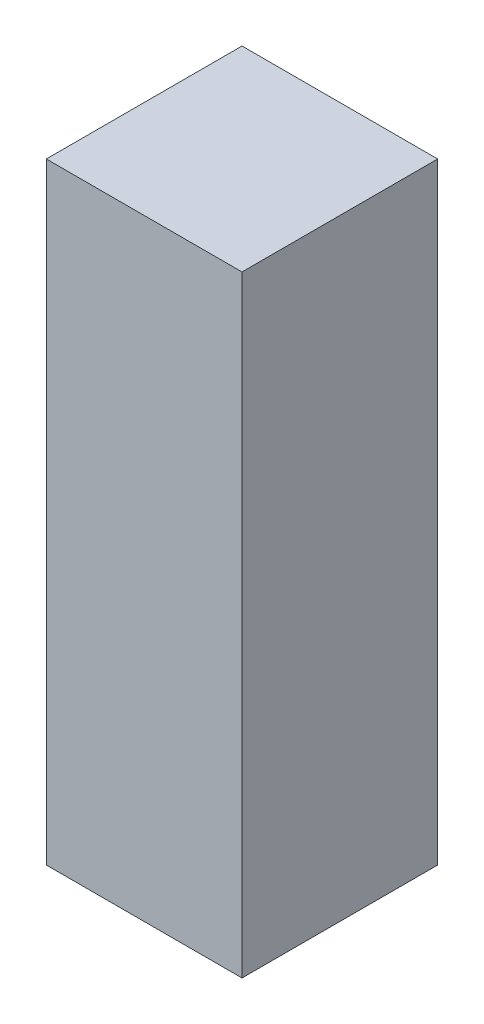
ISO-10303-21;
HEADER;
FILE_DESCRIPTION(('STEP AP214'),'2;1');
FILE_NAME('part.step','',(''),(''),'','','');
FILE_SCHEMA(('AUTOMOTIVE_DESIGN { 1 0 10303 214 1 1 1 1 }'));
ENDSEC;
DATA;
#1=APPLICATION_CONTEXT('core data for automotive mechanical design processes');
#2=APPLICATION_PROTOCOL_DEFINITION('international standard','automotive_design',2000,#1);
#3=PRODUCT_CONTEXT('',#1,'mechanical');
#4=PRODUCT('Part','Part','',(#3));
#5=PRODUCT_RELATED_PRODUCT_CATEGORY('part','',(#4));
#6=PRODUCT_DEFINITION_FORMATION('','',#4);
#7=PRODUCT_DEFINITION_CONTEXT('part definition',#1,'design');
#8=PRODUCT_DEFINITION('design','',#6,#7);
#9=PRODUCT_DEFINITION_SHAPE('','',#8);
#10=(LENGTH_UNIT() NAMED_UNIT(*) SI_UNIT(.MILLI.,.METRE.));
#11=(NAMED_UNIT(*) PLANE_ANGLE_UNIT() SI_UNIT($,.RADIAN.));
#12=(NAMED_UNIT(*) SI_UNIT($,.STERADIAN.) SOLID_ANGLE_UNIT());
#13=UNCERTAINTY_MEASURE_WITH_UNIT(LENGTH_MEASURE(1.E-05),#10,'distance_accuracy_value','');
#14=(GEOMETRIC_REPRESENTATION_CONTEXT(3) GLOBAL_UNCERTAINTY_ASSIGNED_CONTEXT((#13)) GLOBAL_UNIT_ASSIGNED_CONTEXT((#10,
#11,#12)) REPRESENTATION_CONTEXT('',''));
#15=CARTESIAN_POINT('',(0.,0.,0.));
#16=DIRECTION('',(0.,0.,1.));
#17=DIRECTION('',(1.,0.,0.));
#18=AXIS2_PLACEMENT_3D('',#15,#16,#17);
#19=CARTESIAN_POINT('',(-51.7257785467128,250.,-52.1651980029239));
#20=DIRECTION('',(1.,0.,0.));
#21=DIRECTION('',(0.,0.,-1.));
#22=AXIS2_PLACEMENT_3D('',#19,#20,#21);
#23=PLANE('',#22);
#24=DIRECTION('',(0.,0.,1.));
#25=VECTOR('',#24,1.);
#26=CARTESIAN_POINT('',(-51.7257785467128,0.,-52.1651980029239));
#27=LINE('',#26,#25);
#28=CARTESIAN_POINT('',(-51.7257785467128,0.,-52.1651980029239));
#29=VERTEX_POINT('',#28);
#30=CARTESIAN_POINT('',(-51.7257785467128,0.,27.8348019970761));
#31=VERTEX_POINT('',#30);
#32=EDGE_CURVE('E113',#29,#31,#27,.T.);
#33=ORIENTED_EDGE('',*,*,#32,.T.);
#34=DIRECTION('',(0.,-1.,0.));
#35=VECTOR('',#34,1.);
#36=CARTESIAN_POINT('',(-51.7257785467128,250.,27.8348019970761));
#37=LINE('',#36,#35);
#38=CARTESIAN_POINT('',(-51.7257785467128,250.,27.8348019970761));
#39=VERTEX_POINT('',#38);
#40=EDGE_CURVE('E11',#39,#31,#37,.T.);
#41=ORIENTED_EDGE('',*,*,#40,.F.);
#42=DIRECTION('',(0.,0.,1.));
#43=VECTOR('',#42,1.);
#44=CARTESIAN_POINT('',(-51.7257785467128,250.,-52.1651980029239));
#45=LINE('',#44,#43);
#46=CARTESIAN_POINT('',(-51.7257785467128,250.,-52.1651980029239));
#47=VERTEX_POINT('',#46);
#48=EDGE_CURVE('E97',#47,#39,#45,.T.);
#49=ORIENTED_EDGE('',*,*,#48,.F.);
#50=DIRECTION('',(0.,-1.,0.));
#51=VECTOR('',#50,1.);
#52=CARTESIAN_POINT('',(-51.7257785467128,250.,-52.1651980029239));
#53=LINE('',#52,#51);
#54=EDGE_CURVE('E109',#47,#29,#53,.T.);
#55=ORIENTED_EDGE('',*,*,#54,.T.);
#56=EDGE_LOOP('',(#33,#41,#49,#55));
#57=FACE_BOUND('',#56,.T.);
#58=ADVANCED_FACE('F45',(#57),#23,.F.);
#59=CARTESIAN_POINT('',(-51.7257785467128,250.,27.8348019970761));
#60=DIRECTION('',(0.,0.,-1.));
#61=DIRECTION('',(-1.,0.,0.));
#62=AXIS2_PLACEMENT_3D('',#59,#60,#61);
#63=PLANE('',#62);
#64=DIRECTION('',(1.,0.,0.));
#65=VECTOR('',#64,1.);
#66=CARTESIAN_POINT('',(-51.7257785467128,0.,27.8348019970761));
#67=LINE('',#66,#65);
#68=CARTESIAN_POINT('',(28.2742214532872,0.,27.8348019970761));
#69=VERTEX_POINT('',#68);
#70=EDGE_CURVE('E102',#31,#69,#67,.T.);
#71=ORIENTED_EDGE('',*,*,#70,.T.);
#72=DIRECTION('',(0.,-1.,0.));
#73=VECTOR('',#72,1.);
#74=CARTESIAN_POINT('',(28.2742214532872,250.,27.8348019970761));
#75=LINE('',#74,#73);
#76=CARTESIAN_POINT('',(28.2742214532872,250.,27.8348019970761));
#77=VERTEX_POINT('',#76);
#78=EDGE_CURVE('E54',#77,#69,#75,.T.);
#79=ORIENTED_EDGE('',*,*,#78,.F.);
#80=DIRECTION('',(1.,0.,0.));
#81=VECTOR('',#80,1.);
#82=CARTESIAN_POINT('',(-51.7257785467128,250.,27.8348019970761));
#83=LINE('',#82,#81);
#84=EDGE_CURVE('E92',#39,#77,#83,.T.);
#85=ORIENTED_EDGE('',*,*,#84,.F.);
#86=ORIENTED_EDGE('',*,*,#40,.T.);
#87=EDGE_LOOP('',(#71,#79,#85,#86));
#88=FACE_BOUND('',#87,.T.);
#89=ADVANCED_FACE('F101',(#88),#63,.F.);
#90=CARTESIAN_POINT('',(28.2742214532872,250.,-52.1651980029239));
#91=DIRECTION('',(-1.,0.,0.));
#92=DIRECTION('',(0.,0.,1.));
#93=AXIS2_PLACEMENT_3D('',#90,#91,#92);
#94=PLANE('',#93);
#95=DIRECTION('',(0.,0.,-1.));
#96=VECTOR('',#95,1.);
#97=CARTESIAN_POINT('',(28.2742214532872,0.,-52.1651980029239));
#98=LINE('',#97,#96);
#99=CARTESIAN_POINT('',(28.2742214532872,0.,-52.1651980029239));
#100=VERTEX_POINT('',#99);
#101=EDGE_CURVE('E79',#69,#100,#98,.T.);
#102=ORIENTED_EDGE('',*,*,#101,.T.);
#103=DIRECTION('',(0.,-1.,0.));
#104=VECTOR('',#103,1.);
#105=CARTESIAN_POINT('',(28.2742214532872,250.,-52.1651980029239));
#106=LINE('',#105,#104);
#107=CARTESIAN_POINT('',(28.2742214532872,250.,-52.1651980029239));
#108=VERTEX_POINT('',#107);
#109=EDGE_CURVE('E104',#108,#100,#106,.T.);
#110=ORIENTED_EDGE('',*,*,#109,.F.);
#111=DIRECTION('',(0.,0.,-1.));
#112=VECTOR('',#111,1.);
#113=CARTESIAN_POINT('',(28.2742214532872,250.,-52.1651980029239));
#114=LINE('',#113,#112);
#115=EDGE_CURVE('E95',#77,#108,#114,.T.);
#116=ORIENTED_EDGE('',*,*,#115,.F.);
#117=ORIENTED_EDGE('',*,*,#78,.T.);
#118=EDGE_LOOP('',(#102,#110,#116,#117));
#119=FACE_BOUND('',#118,.T.);
#120=ADVANCED_FACE('F105',(#119),#94,.F.);
#121=CARTESIAN_POINT('',(-51.7257785467128,250.,-52.1651980029239));
#122=DIRECTION('',(0.,0.,1.));
#123=DIRECTION('',(1.,0.,0.));
#124=AXIS2_PLACEMENT_3D('',#121,#122,#123);
#125=PLANE('',#124);
#126=DIRECTION('',(-1.,0.,0.));
#127=VECTOR('',#126,1.);
#128=CARTESIAN_POINT('',(-51.7257785467128,0.,-52.1651980029239));
#129=LINE('',#128,#127);
#130=EDGE_CURVE('E85',#100,#29,#129,.T.);
#131=ORIENTED_EDGE('',*,*,#130,.T.);
#132=ORIENTED_EDGE('',*,*,#54,.F.);
#133=DIRECTION('',(-1.,0.,0.));
#134=VECTOR('',#133,1.);
#135=CARTESIAN_POINT('',(-51.7257785467128,250.,-52.1651980029239));
#136=LINE('',#135,#134);
#137=EDGE_CURVE('E62',#108,#47,#136,.T.);
#138=ORIENTED_EDGE('',*,*,#137,.F.);
#139=ORIENTED_EDGE('',*,*,#109,.T.);
#140=EDGE_LOOP('',(#131,#132,#138,#139));
#141=FACE_BOUND('',#140,.T.);
#142=ADVANCED_FACE('F126',(#141),#125,.F.);
#143=CARTESIAN_POINT('',(0.,250.,0.));
#144=DIRECTION('',(0.,1.,0.));
#145=DIRECTION('',(0.,0.,1.));
#146=AXIS2_PLACEMENT_3D('',#143,#144,#145);
#147=PLANE('',#146);
#148=ORIENTED_EDGE('',*,*,#48,.T.);
#149=ORIENTED_EDGE('',*,*,#84,.T.);
#150=ORIENTED_EDGE('',*,*,#115,.T.);
#151=ORIENTED_EDGE('',*,*,#137,.T.);
#152=EDGE_LOOP('',(#148,#149,#150,#151));
#153=FACE_BOUND('',#152,.T.);
#154=ADVANCED_FACE('F93',(#153),#147,.T.);
#155=CARTESIAN_POINT('',(0.,0.,0.));
#156=DIRECTION('',(0.,1.,0.));
#157=DIRECTION('',(0.,0.,1.));
#158=AXIS2_PLACEMENT_3D('',#155,#156,#157);
#159=PLANE('',#158);
#160=ORIENTED_EDGE('',*,*,#32,.F.);
#161=ORIENTED_EDGE('',*,*,#130,.F.);
#162=ORIENTED_EDGE('',*,*,#101,.F.);
#163=ORIENTED_EDGE('',*,*,#70,.F.);
#164=EDGE_LOOP('',(#160,#161,#162,#163));
#165=FACE_BOUND('',#164,.T.);
#166=ADVANCED_FACE('F129',(#165),#159,.F.);
#167=CLOSED_SHELL('',(#58,#89,#120,#142,#154,#166));
#168=MANIFOLD_SOLID_BREP('B2',#167);
#169=ADVANCED_BREP_SHAPE_REPRESENTATION('',(#18,#168),#14);
#170=SHAPE_DEFINITION_REPRESENTATION(#9,#169);
ENDSEC;
END-ISO-10303-21;
